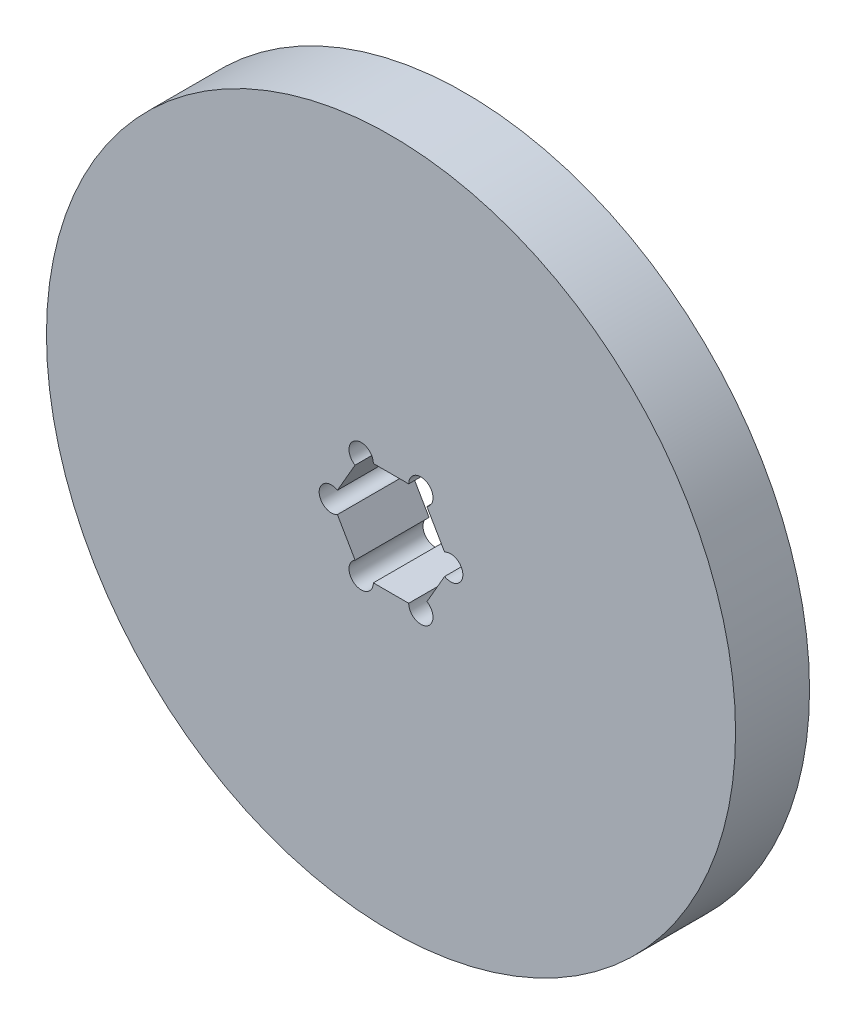
ISO-10303-21;
HEADER;
FILE_DESCRIPTION(('STEP AP214'),'2;1');
FILE_NAME('part.step','',(''),(''),'','','');
FILE_SCHEMA(('AUTOMOTIVE_DESIGN { 1 0 10303 214 1 1 1 1 }'));
ENDSEC;
DATA;
#1=APPLICATION_CONTEXT('core data for automotive mechanical design processes');
#2=APPLICATION_PROTOCOL_DEFINITION('international standard','automotive_design',2000,#1);
#3=PRODUCT_CONTEXT('',#1,'mechanical');
#4=PRODUCT('Part','Part','',(#3));
#5=PRODUCT_RELATED_PRODUCT_CATEGORY('part','',(#4));
#6=PRODUCT_DEFINITION_FORMATION('','',#4);
#7=PRODUCT_DEFINITION_CONTEXT('part definition',#1,'design');
#8=PRODUCT_DEFINITION('design','',#6,#7);
#9=PRODUCT_DEFINITION_SHAPE('','',#8);
#10=(LENGTH_UNIT() NAMED_UNIT(*) SI_UNIT(.MILLI.,.METRE.));
#11=(NAMED_UNIT(*) PLANE_ANGLE_UNIT() SI_UNIT($,.RADIAN.));
#12=(NAMED_UNIT(*) SI_UNIT($,.STERADIAN.) SOLID_ANGLE_UNIT());
#13=UNCERTAINTY_MEASURE_WITH_UNIT(LENGTH_MEASURE(1.E-05),#10,'distance_accuracy_value','');
#14=(GEOMETRIC_REPRESENTATION_CONTEXT(3) GLOBAL_UNCERTAINTY_ASSIGNED_CONTEXT((#13)) GLOBAL_UNIT_ASSIGNED_CONTEXT((#10,
#11,#12)) REPRESENTATION_CONTEXT('',''));
#15=CARTESIAN_POINT('',(0.,0.,0.));
#16=DIRECTION('',(0.,0.,1.));
#17=DIRECTION('',(1.,0.,0.));
#18=AXIS2_PLACEMENT_3D('',#15,#16,#17);
#19=CARTESIAN_POINT('',(-7.47899538708241,0.,9.271));
#20=DIRECTION('',(0.,0.,-1.));
#21=DIRECTION('',(-1.,0.,0.));
#22=AXIS2_PLACEMENT_3D('',#19,#20,#21);
#23=CYLINDRICAL_SURFACE('',#22,1.524);
#24=CARTESIAN_POINT('',(-7.47899538708241,0.,0.));
#25=DIRECTION('',(0.,0.,1.));
#26=DIRECTION('',(1.,0.,0.));
#27=AXIS2_PLACEMENT_3D('',#24,#25,#26);
#28=CIRCLE('',#27,1.524);
#29=CARTESIAN_POINT('',(-6.71699538708241,1.31982271536748,0.));
#30=VERTEX_POINT('',#29);
#31=CARTESIAN_POINT('',(-6.71699538708241,-1.31982271536749,0.));
#32=VERTEX_POINT('',#31);
#33=EDGE_CURVE('E158',#30,#32,#28,.T.);
#34=ORIENTED_EDGE('',*,*,#33,.F.);
#35=DIRECTION('',(0.,0.,-1.));
#36=VECTOR('',#35,1.);
#37=CARTESIAN_POINT('',(-6.71699538708241,1.31982271536748,9.271));
#38=LINE('',#37,#36);
#39=CARTESIAN_POINT('',(-6.71699538708241,1.31982271536748,9.271));
#40=VERTEX_POINT('',#39);
#41=EDGE_CURVE('E11',#40,#30,#38,.T.);
#42=ORIENTED_EDGE('',*,*,#41,.F.);
#43=CARTESIAN_POINT('',(-7.47899538708241,0.,9.271));
#44=DIRECTION('',(0.,0.,1.));
#45=DIRECTION('',(1.,0.,0.));
#46=AXIS2_PLACEMENT_3D('',#43,#44,#45);
#47=CIRCLE('',#46,1.524);
#48=CARTESIAN_POINT('',(-6.71699538708241,-1.31982271536749,9.271));
#49=VERTEX_POINT('',#48);
#50=EDGE_CURVE('E193',#40,#49,#47,.T.);
#51=ORIENTED_EDGE('',*,*,#50,.T.);
#52=DIRECTION('',(0.,0.,-1.));
#53=VECTOR('',#52,1.);
#54=CARTESIAN_POINT('',(-6.71699538708241,-1.31982271536749,9.271));
#55=LINE('',#54,#53);
#56=EDGE_CURVE('E53',#49,#32,#55,.T.);
#57=ORIENTED_EDGE('',*,*,#56,.T.);
#58=EDGE_LOOP('',(#34,#42,#51,#57));
#59=FACE_BOUND('',#58,.T.);
#60=ADVANCED_FACE('F37',(#59),#23,.F.);
#61=CARTESIAN_POINT('',(-5.60924654031181,3.2385,9.271));
#62=DIRECTION('',(0.866025403784439,-0.499999999999999,0.));
#63=DIRECTION('',(0.499999999999999,0.866025403784439,0.));
#64=AXIS2_PLACEMENT_3D('',#61,#62,#63);
#65=PLANE('',#64);
#66=DIRECTION('',(-0.499999999999999,-0.866025403784439,0.));
#67=VECTOR('',#66,1.);
#68=CARTESIAN_POINT('',(-5.60924654031181,3.2385,0.));
#69=LINE('',#68,#67);
#70=CARTESIAN_POINT('',(-4.50149769354121,5.15717728463252,0.));
#71=VERTEX_POINT('',#70);
#72=EDGE_CURVE('E160',#71,#30,#69,.T.);
#73=ORIENTED_EDGE('',*,*,#72,.F.);
#74=DIRECTION('',(0.,0.,-1.));
#75=VECTOR('',#74,1.);
#76=CARTESIAN_POINT('',(-4.50149769354121,5.15717728463252,9.271));
#77=LINE('',#76,#75);
#78=CARTESIAN_POINT('',(-4.50149769354121,5.15717728463252,9.271));
#79=VERTEX_POINT('',#78);
#80=EDGE_CURVE('E45',#79,#71,#77,.T.);
#81=ORIENTED_EDGE('',*,*,#80,.F.);
#82=DIRECTION('',(-0.499999999999999,-0.866025403784439,0.));
#83=VECTOR('',#82,1.);
#84=CARTESIAN_POINT('',(-5.60924654031181,3.2385,9.271));
#85=LINE('',#84,#83);
#86=EDGE_CURVE('E231',#79,#40,#85,.T.);
#87=ORIENTED_EDGE('',*,*,#86,.T.);
#88=ORIENTED_EDGE('',*,*,#41,.T.);
#89=EDGE_LOOP('',(#73,#81,#87,#88));
#90=FACE_BOUND('',#89,.T.);
#91=ADVANCED_FACE('F218',(#90),#65,.T.);
#92=CARTESIAN_POINT('',(-3.73949769354121,6.477,9.271));
#93=DIRECTION('',(0.,0.,-1.));
#94=DIRECTION('',(-1.,0.,0.));
#95=AXIS2_PLACEMENT_3D('',#92,#93,#94);
#96=CYLINDRICAL_SURFACE('',#95,1.524);
#97=CARTESIAN_POINT('',(-3.73949769354121,6.477,0.));
#98=DIRECTION('',(0.,0.,1.));
#99=DIRECTION('',(1.,0.,0.));
#100=AXIS2_PLACEMENT_3D('',#97,#98,#99);
#101=CIRCLE('',#100,1.524);
#102=CARTESIAN_POINT('',(-2.21549769354121,6.477,0.));
#103=VERTEX_POINT('',#102);
#104=EDGE_CURVE('E163',#103,#71,#101,.T.);
#105=ORIENTED_EDGE('',*,*,#104,.F.);
#106=DIRECTION('',(0.,0.,-1.));
#107=VECTOR('',#106,1.);
#108=CARTESIAN_POINT('',(-2.21549769354121,6.477,9.271));
#109=LINE('',#108,#107);
#110=CARTESIAN_POINT('',(-2.21549769354121,6.477,9.271));
#111=VERTEX_POINT('',#110);
#112=EDGE_CURVE('E207',#111,#103,#109,.T.);
#113=ORIENTED_EDGE('',*,*,#112,.F.);
#114=CARTESIAN_POINT('',(-3.73949769354121,6.477,9.271));
#115=DIRECTION('',(0.,0.,1.));
#116=DIRECTION('',(1.,0.,0.));
#117=AXIS2_PLACEMENT_3D('',#114,#115,#116);
#118=CIRCLE('',#117,1.524);
#119=EDGE_CURVE('E214',#111,#79,#118,.T.);
#120=ORIENTED_EDGE('',*,*,#119,.T.);
#121=ORIENTED_EDGE('',*,*,#80,.T.);
#122=EDGE_LOOP('',(#105,#113,#120,#121));
#123=FACE_BOUND('',#122,.T.);
#124=ADVANCED_FACE('F212',(#123),#96,.F.);
#125=CARTESIAN_POINT('',(0.,6.477,9.271));
#126=DIRECTION('',(0.,-1.,0.));
#127=DIRECTION('',(1.,0.,0.));
#128=AXIS2_PLACEMENT_3D('',#125,#126,#127);
#129=PLANE('',#128);
#130=DIRECTION('',(-1.,0.,0.));
#131=VECTOR('',#130,1.);
#132=CARTESIAN_POINT('',(0.,6.477,0.));
#133=LINE('',#132,#131);
#134=CARTESIAN_POINT('',(2.2154976935412,6.477,0.));
#135=VERTEX_POINT('',#134);
#136=EDGE_CURVE('E166',#135,#103,#133,.T.);
#137=ORIENTED_EDGE('',*,*,#136,.F.);
#138=DIRECTION('',(0.,0.,-1.));
#139=VECTOR('',#138,1.);
#140=CARTESIAN_POINT('',(2.2154976935412,6.477,9.271));
#141=LINE('',#140,#139);
#142=CARTESIAN_POINT('',(2.2154976935412,6.477,9.271));
#143=VERTEX_POINT('',#142);
#144=EDGE_CURVE('E205',#143,#135,#141,.T.);
#145=ORIENTED_EDGE('',*,*,#144,.F.);
#146=DIRECTION('',(-1.,0.,0.));
#147=VECTOR('',#146,1.);
#148=CARTESIAN_POINT('',(0.,6.477,9.271));
#149=LINE('',#148,#147);
#150=EDGE_CURVE('E228',#143,#111,#149,.T.);
#151=ORIENTED_EDGE('',*,*,#150,.T.);
#152=ORIENTED_EDGE('',*,*,#112,.T.);
#153=EDGE_LOOP('',(#137,#145,#151,#152));
#154=FACE_BOUND('',#153,.T.);
#155=ADVANCED_FACE('F225',(#154),#129,.T.);
#156=CARTESIAN_POINT('',(3.7394976935412,6.477,9.271));
#157=DIRECTION('',(0.,0.,-1.));
#158=DIRECTION('',(-1.,0.,0.));
#159=AXIS2_PLACEMENT_3D('',#156,#157,#158);
#160=CYLINDRICAL_SURFACE('',#159,1.524);
#161=CARTESIAN_POINT('',(3.7394976935412,6.477,0.));
#162=DIRECTION('',(0.,0.,1.));
#163=DIRECTION('',(1.,0.,0.));
#164=AXIS2_PLACEMENT_3D('',#161,#162,#163);
#165=CIRCLE('',#164,1.524);
#166=CARTESIAN_POINT('',(4.50149769354121,5.15717728463252,0.));
#167=VERTEX_POINT('',#166);
#168=EDGE_CURVE('E169',#167,#135,#165,.T.);
#169=ORIENTED_EDGE('',*,*,#168,.F.);
#170=DIRECTION('',(0.,0.,-1.));
#171=VECTOR('',#170,1.);
#172=CARTESIAN_POINT('',(4.50149769354121,5.15717728463252,9.271));
#173=LINE('',#172,#171);
#174=CARTESIAN_POINT('',(4.50149769354121,5.15717728463252,9.271));
#175=VERTEX_POINT('',#174);
#176=EDGE_CURVE('E203',#175,#167,#173,.T.);
#177=ORIENTED_EDGE('',*,*,#176,.F.);
#178=CARTESIAN_POINT('',(3.7394976935412,6.477,9.271));
#179=DIRECTION('',(0.,0.,1.));
#180=DIRECTION('',(1.,0.,0.));
#181=AXIS2_PLACEMENT_3D('',#178,#179,#180);
#182=CIRCLE('',#181,1.524);
#183=EDGE_CURVE('E233',#175,#143,#182,.T.);
#184=ORIENTED_EDGE('',*,*,#183,.T.);
#185=ORIENTED_EDGE('',*,*,#144,.T.);
#186=EDGE_LOOP('',(#169,#177,#184,#185));
#187=FACE_BOUND('',#186,.T.);
#188=ADVANCED_FACE('F273',(#187),#160,.F.);
#189=CARTESIAN_POINT('',(5.60924654031181,3.2385,9.271));
#190=DIRECTION('',(-0.866025403784438,-0.5,0.));
#191=DIRECTION('',(0.5,-0.866025403784438,0.));
#192=AXIS2_PLACEMENT_3D('',#189,#190,#191);
#193=PLANE('',#192);
#194=DIRECTION('',(-0.5,0.866025403784439,0.));
#195=VECTOR('',#194,1.);
#196=CARTESIAN_POINT('',(5.60924654031181,3.2385,0.));
#197=LINE('',#196,#195);
#198=CARTESIAN_POINT('',(6.71699538708241,1.31982271536749,0.));
#199=VERTEX_POINT('',#198);
#200=EDGE_CURVE('E172',#199,#167,#197,.T.);
#201=ORIENTED_EDGE('',*,*,#200,.F.);
#202=DIRECTION('',(0.,0.,-1.));
#203=VECTOR('',#202,1.);
#204=CARTESIAN_POINT('',(6.71699538708241,1.31982271536749,9.271));
#205=LINE('',#204,#203);
#206=CARTESIAN_POINT('',(6.71699538708241,1.31982271536749,9.271));
#207=VERTEX_POINT('',#206);
#208=EDGE_CURVE('E201',#207,#199,#205,.T.);
#209=ORIENTED_EDGE('',*,*,#208,.F.);
#210=DIRECTION('',(-0.5,0.866025403784439,0.));
#211=VECTOR('',#210,1.);
#212=CARTESIAN_POINT('',(5.60924654031181,3.2385,9.271));
#213=LINE('',#212,#211);
#214=EDGE_CURVE('E239',#207,#175,#213,.T.);
#215=ORIENTED_EDGE('',*,*,#214,.T.);
#216=ORIENTED_EDGE('',*,*,#176,.T.);
#217=EDGE_LOOP('',(#201,#209,#215,#216));
#218=FACE_BOUND('',#217,.T.);
#219=ADVANCED_FACE('F276',(#218),#193,.T.);
#220=CARTESIAN_POINT('',(7.47899538708241,0.,9.271));
#221=DIRECTION('',(0.,0.,-1.));
#222=DIRECTION('',(-1.,0.,0.));
#223=AXIS2_PLACEMENT_3D('',#220,#221,#222);
#224=CYLINDRICAL_SURFACE('',#223,1.524);
#225=CARTESIAN_POINT('',(7.47899538708241,0.,0.));
#226=DIRECTION('',(0.,0.,1.));
#227=DIRECTION('',(1.,0.,0.));
#228=AXIS2_PLACEMENT_3D('',#225,#226,#227);
#229=CIRCLE('',#228,1.524);
#230=CARTESIAN_POINT('',(6.71699538708241,-1.31982271536748,0.));
#231=VERTEX_POINT('',#230);
#232=EDGE_CURVE('E175',#231,#199,#229,.T.);
#233=ORIENTED_EDGE('',*,*,#232,.F.);
#234=DIRECTION('',(0.,0.,-1.));
#235=VECTOR('',#234,1.);
#236=CARTESIAN_POINT('',(6.71699538708241,-1.31982271536748,9.271));
#237=LINE('',#236,#235);
#238=CARTESIAN_POINT('',(6.71699538708241,-1.31982271536748,9.271));
#239=VERTEX_POINT('',#238);
#240=EDGE_CURVE('E199',#239,#231,#237,.T.);
#241=ORIENTED_EDGE('',*,*,#240,.F.);
#242=CARTESIAN_POINT('',(7.47899538708241,0.,9.271));
#243=DIRECTION('',(0.,0.,1.));
#244=DIRECTION('',(1.,0.,0.));
#245=AXIS2_PLACEMENT_3D('',#242,#243,#244);
#246=CIRCLE('',#245,1.524);
#247=EDGE_CURVE('E242',#239,#207,#246,.T.);
#248=ORIENTED_EDGE('',*,*,#247,.T.);
#249=ORIENTED_EDGE('',*,*,#208,.T.);
#250=EDGE_LOOP('',(#233,#241,#248,#249));
#251=FACE_BOUND('',#250,.T.);
#252=ADVANCED_FACE('F280',(#251),#224,.F.);
#253=CARTESIAN_POINT('',(5.60924654031181,-3.2385,9.271));
#254=DIRECTION('',(-0.866025403784439,0.499999999999999,0.));
#255=DIRECTION('',(-0.5,-0.866025403784439,0.));
#256=AXIS2_PLACEMENT_3D('',#253,#254,#255);
#257=PLANE('',#256);
#258=DIRECTION('',(0.499999999999999,0.866025403784439,0.));
#259=VECTOR('',#258,1.);
#260=CARTESIAN_POINT('',(5.60924654031181,-3.2385,0.));
#261=LINE('',#260,#259);
#262=CARTESIAN_POINT('',(4.50149769354121,-5.15717728463252,0.));
#263=VERTEX_POINT('',#262);
#264=EDGE_CURVE('E178',#263,#231,#261,.T.);
#265=ORIENTED_EDGE('',*,*,#264,.F.);
#266=DIRECTION('',(0.,0.,-1.));
#267=VECTOR('',#266,1.);
#268=CARTESIAN_POINT('',(4.50149769354121,-5.15717728463252,9.271));
#269=LINE('',#268,#267);
#270=CARTESIAN_POINT('',(4.50149769354121,-5.15717728463252,9.271));
#271=VERTEX_POINT('',#270);
#272=EDGE_CURVE('E197',#271,#263,#269,.T.);
#273=ORIENTED_EDGE('',*,*,#272,.F.);
#274=DIRECTION('',(0.499999999999999,0.866025403784439,0.));
#275=VECTOR('',#274,1.);
#276=CARTESIAN_POINT('',(5.60924654031181,-3.2385,9.271));
#277=LINE('',#276,#275);
#278=EDGE_CURVE('E245',#271,#239,#277,.T.);
#279=ORIENTED_EDGE('',*,*,#278,.T.);
#280=ORIENTED_EDGE('',*,*,#240,.T.);
#281=EDGE_LOOP('',(#265,#273,#279,#280));
#282=FACE_BOUND('',#281,.T.);
#283=ADVANCED_FACE('F284',(#282),#257,.T.);
#284=CARTESIAN_POINT('',(3.73949769354121,-6.477,9.271));
#285=DIRECTION('',(0.,0.,-1.));
#286=DIRECTION('',(-1.,0.,0.));
#287=AXIS2_PLACEMENT_3D('',#284,#285,#286);
#288=CYLINDRICAL_SURFACE('',#287,1.524);
#289=CARTESIAN_POINT('',(3.73949769354121,-6.477,0.));
#290=DIRECTION('',(0.,0.,1.));
#291=DIRECTION('',(1.,0.,0.));
#292=AXIS2_PLACEMENT_3D('',#289,#290,#291);
#293=CIRCLE('',#292,1.524);
#294=CARTESIAN_POINT('',(2.21549769354121,-6.477,0.));
#295=VERTEX_POINT('',#294);
#296=EDGE_CURVE('E181',#295,#263,#293,.T.);
#297=ORIENTED_EDGE('',*,*,#296,.F.);
#298=DIRECTION('',(0.,0.,-1.));
#299=VECTOR('',#298,1.);
#300=CARTESIAN_POINT('',(2.21549769354121,-6.477,9.271));
#301=LINE('',#300,#299);
#302=CARTESIAN_POINT('',(2.21549769354121,-6.477,9.271));
#303=VERTEX_POINT('',#302);
#304=EDGE_CURVE('E136',#303,#295,#301,.T.);
#305=ORIENTED_EDGE('',*,*,#304,.F.);
#306=CARTESIAN_POINT('',(3.73949769354121,-6.477,9.271));
#307=DIRECTION('',(0.,0.,1.));
#308=DIRECTION('',(1.,0.,0.));
#309=AXIS2_PLACEMENT_3D('',#306,#307,#308);
#310=CIRCLE('',#309,1.524);
#311=EDGE_CURVE('E147',#303,#271,#310,.T.);
#312=ORIENTED_EDGE('',*,*,#311,.T.);
#313=ORIENTED_EDGE('',*,*,#272,.T.);
#314=EDGE_LOOP('',(#297,#305,#312,#313));
#315=FACE_BOUND('',#314,.T.);
#316=ADVANCED_FACE('F249',(#315),#288,.F.);
#317=CARTESIAN_POINT('',(0.,-6.477,9.271));
#318=DIRECTION('',(0.,1.,0.));
#319=DIRECTION('',(-1.,0.,0.));
#320=AXIS2_PLACEMENT_3D('',#317,#318,#319);
#321=PLANE('',#320);
#322=DIRECTION('',(1.,0.,0.));
#323=VECTOR('',#322,1.);
#324=CARTESIAN_POINT('',(0.,-6.477,0.));
#325=LINE('',#324,#323);
#326=CARTESIAN_POINT('',(-2.2154976935412,-6.477,0.));
#327=VERTEX_POINT('',#326);
#328=EDGE_CURVE('E132',#327,#295,#325,.T.);
#329=ORIENTED_EDGE('',*,*,#328,.F.);
#330=DIRECTION('',(0.,0.,-1.));
#331=VECTOR('',#330,1.);
#332=CARTESIAN_POINT('',(-2.2154976935412,-6.477,9.271));
#333=LINE('',#332,#331);
#334=CARTESIAN_POINT('',(-2.2154976935412,-6.477,9.271));
#335=VERTEX_POINT('',#334);
#336=EDGE_CURVE('E127',#335,#327,#333,.T.);
#337=ORIENTED_EDGE('',*,*,#336,.F.);
#338=DIRECTION('',(1.,0.,0.));
#339=VECTOR('',#338,1.);
#340=CARTESIAN_POINT('',(0.,-6.477,9.271));
#341=LINE('',#340,#339);
#342=EDGE_CURVE('E130',#335,#303,#341,.T.);
#343=ORIENTED_EDGE('',*,*,#342,.T.);
#344=ORIENTED_EDGE('',*,*,#304,.T.);
#345=EDGE_LOOP('',(#329,#337,#343,#344));
#346=FACE_BOUND('',#345,.T.);
#347=ADVANCED_FACE('F129',(#346),#321,.T.);
#348=CARTESIAN_POINT('',(-3.7394976935412,-6.477,9.271));
#349=DIRECTION('',(0.,0.,-1.));
#350=DIRECTION('',(-1.,0.,0.));
#351=AXIS2_PLACEMENT_3D('',#348,#349,#350);
#352=CYLINDRICAL_SURFACE('',#351,1.524);
#353=CARTESIAN_POINT('',(-3.7394976935412,-6.477,0.));
#354=DIRECTION('',(0.,0.,1.));
#355=DIRECTION('',(1.,0.,0.));
#356=AXIS2_PLACEMENT_3D('',#353,#354,#355);
#357=CIRCLE('',#356,1.524);
#358=CARTESIAN_POINT('',(-4.5014976935412,-5.15717728463252,0.));
#359=VERTEX_POINT('',#358);
#360=EDGE_CURVE('E185',#359,#327,#357,.T.);
#361=ORIENTED_EDGE('',*,*,#360,.F.);
#362=DIRECTION('',(0.,0.,-1.));
#363=VECTOR('',#362,1.);
#364=CARTESIAN_POINT('',(-4.5014976935412,-5.15717728463252,9.271));
#365=LINE('',#364,#363);
#366=CARTESIAN_POINT('',(-4.5014976935412,-5.15717728463252,9.271));
#367=VERTEX_POINT('',#366);
#368=EDGE_CURVE('E90',#367,#359,#365,.T.);
#369=ORIENTED_EDGE('',*,*,#368,.F.);
#370=CARTESIAN_POINT('',(-3.7394976935412,-6.477,9.271));
#371=DIRECTION('',(0.,0.,1.));
#372=DIRECTION('',(1.,0.,0.));
#373=AXIS2_PLACEMENT_3D('',#370,#371,#372);
#374=CIRCLE('',#373,1.524);
#375=EDGE_CURVE('E144',#367,#335,#374,.T.);
#376=ORIENTED_EDGE('',*,*,#375,.T.);
#377=ORIENTED_EDGE('',*,*,#336,.T.);
#378=EDGE_LOOP('',(#361,#369,#376,#377));
#379=FACE_BOUND('',#378,.T.);
#380=ADVANCED_FACE('F149',(#379),#352,.F.);
#381=CARTESIAN_POINT('',(-5.60924654031181,-3.2385,9.271));
#382=DIRECTION('',(0.866025403784438,0.5,0.));
#383=DIRECTION('',(-0.5,0.866025403784439,0.));
#384=AXIS2_PLACEMENT_3D('',#381,#382,#383);
#385=PLANE('',#384);
#386=DIRECTION('',(0.5,-0.866025403784438,0.));
#387=VECTOR('',#386,1.);
#388=CARTESIAN_POINT('',(-5.60924654031181,-3.2385,0.));
#389=LINE('',#388,#387);
#390=EDGE_CURVE('E187',#32,#359,#389,.T.);
#391=ORIENTED_EDGE('',*,*,#390,.F.);
#392=ORIENTED_EDGE('',*,*,#56,.F.);
#393=DIRECTION('',(0.5,-0.866025403784438,0.));
#394=VECTOR('',#393,1.);
#395=CARTESIAN_POINT('',(-5.60924654031181,-3.2385,9.271));
#396=LINE('',#395,#394);
#397=EDGE_CURVE('E150',#49,#367,#396,.T.);
#398=ORIENTED_EDGE('',*,*,#397,.T.);
#399=ORIENTED_EDGE('',*,*,#368,.T.);
#400=EDGE_LOOP('',(#391,#392,#398,#399));
#401=FACE_BOUND('',#400,.T.);
#402=ADVANCED_FACE('F251',(#401),#385,.T.);
#403=CARTESIAN_POINT('',(0.,0.,9.271));
#404=DIRECTION('',(0.,0.,-1.));
#405=DIRECTION('',(-1.,0.,0.));
#406=AXIS2_PLACEMENT_3D('',#403,#404,#405);
#407=CYLINDRICAL_SURFACE('',#406,43.18);
#408=CARTESIAN_POINT('',(0.,0.,9.271));
#409=DIRECTION('',(0.,0.,1.));
#410=DIRECTION('',(1.,0.,0.));
#411=AXIS2_PLACEMENT_3D('',#408,#409,#410);
#412=CIRCLE('',#411,43.18);
#413=CARTESIAN_POINT('',(43.18,0.,9.271));
#414=VERTEX_POINT('',#413);
#415=EDGE_CURVE('E152',#414,#414,#412,.T.);
#416=ORIENTED_EDGE('',*,*,#415,.F.);
#417=EDGE_LOOP('',(#416));
#418=FACE_BOUND('',#417,.T.);
#419=CARTESIAN_POINT('',(0.,0.,0.));
#420=DIRECTION('',(0.,0.,1.));
#421=DIRECTION('',(1.,0.,0.));
#422=AXIS2_PLACEMENT_3D('',#419,#420,#421);
#423=CIRCLE('',#422,43.18);
#424=CARTESIAN_POINT('',(43.18,0.,0.));
#425=VERTEX_POINT('',#424);
#426=EDGE_CURVE('E190',#425,#425,#423,.T.);
#427=ORIENTED_EDGE('',*,*,#426,.T.);
#428=EDGE_LOOP('',(#427));
#429=FACE_BOUND('',#428,.T.);
#430=ADVANCED_FACE('F253',(#418,#429),#407,.T.);
#431=CARTESIAN_POINT('',(0.,0.,9.271));
#432=DIRECTION('',(0.,0.,1.));
#433=DIRECTION('',(1.,0.,0.));
#434=AXIS2_PLACEMENT_3D('',#431,#432,#433);
#435=PLANE('',#434);
#436=ORIENTED_EDGE('',*,*,#50,.F.);
#437=ORIENTED_EDGE('',*,*,#86,.F.);
#438=ORIENTED_EDGE('',*,*,#119,.F.);
#439=ORIENTED_EDGE('',*,*,#150,.F.);
#440=ORIENTED_EDGE('',*,*,#183,.F.);
#441=ORIENTED_EDGE('',*,*,#214,.F.);
#442=ORIENTED_EDGE('',*,*,#247,.F.);
#443=ORIENTED_EDGE('',*,*,#278,.F.);
#444=ORIENTED_EDGE('',*,*,#311,.F.);
#445=ORIENTED_EDGE('',*,*,#342,.F.);
#446=ORIENTED_EDGE('',*,*,#375,.F.);
#447=ORIENTED_EDGE('',*,*,#397,.F.);
#448=EDGE_LOOP('',(#436,#437,#438,#439,#440,#441,#442,#443,#444,#445,#446,#447));
#449=FACE_BOUND('',#448,.T.);
#450=ORIENTED_EDGE('',*,*,#415,.T.);
#451=EDGE_LOOP('',(#450));
#452=FACE_BOUND('',#451,.T.);
#453=ADVANCED_FACE('F141',(#449,#452),#435,.T.);
#454=CARTESIAN_POINT('',(0.,0.,0.));
#455=DIRECTION('',(0.,0.,1.));
#456=DIRECTION('',(1.,0.,0.));
#457=AXIS2_PLACEMENT_3D('',#454,#455,#456);
#458=PLANE('',#457);
#459=ORIENTED_EDGE('',*,*,#33,.T.);
#460=ORIENTED_EDGE('',*,*,#390,.T.);
#461=ORIENTED_EDGE('',*,*,#360,.T.);
#462=ORIENTED_EDGE('',*,*,#328,.T.);
#463=ORIENTED_EDGE('',*,*,#296,.T.);
#464=ORIENTED_EDGE('',*,*,#264,.T.);
#465=ORIENTED_EDGE('',*,*,#232,.T.);
#466=ORIENTED_EDGE('',*,*,#200,.T.);
#467=ORIENTED_EDGE('',*,*,#168,.T.);
#468=ORIENTED_EDGE('',*,*,#136,.T.);
#469=ORIENTED_EDGE('',*,*,#104,.T.);
#470=ORIENTED_EDGE('',*,*,#72,.T.);
#471=EDGE_LOOP('',(#459,#460,#461,#462,#463,#464,#465,#466,#467,#468,#469,#470));
#472=FACE_BOUND('',#471,.T.);
#473=ORIENTED_EDGE('',*,*,#426,.F.);
#474=EDGE_LOOP('',(#473));
#475=FACE_BOUND('',#474,.T.);
#476=ADVANCED_FACE('F220',(#472,#475),#458,.F.);
#477=CLOSED_SHELL('',(#60,#91,#124,#155,#188,#219,#252,#283,#316,#347,#380,#402,#430,#453,#476));
#478=MANIFOLD_SOLID_BREP('B2',#477);
#479=ADVANCED_BREP_SHAPE_REPRESENTATION('',(#18,#478),#14);
#480=SHAPE_DEFINITION_REPRESENTATION(#9,#479);
ENDSEC;
END-ISO-10303-21;
